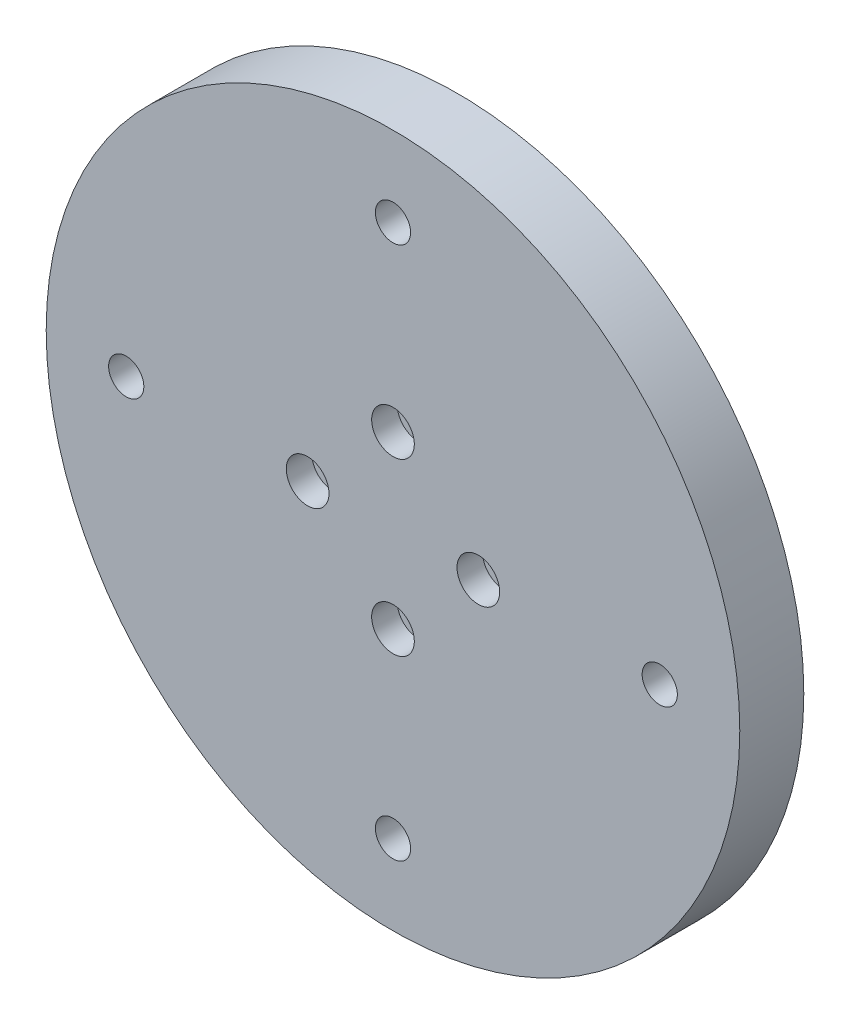
ISO-10303-21;
HEADER;
FILE_DESCRIPTION(('STEP AP214'),'2;1');
FILE_NAME('part.step','',(''),(''),'','','');
FILE_SCHEMA(('AUTOMOTIVE_DESIGN { 1 0 10303 214 1 1 1 1 }'));
ENDSEC;
DATA;
#1=APPLICATION_CONTEXT('core data for automotive mechanical design processes');
#2=APPLICATION_PROTOCOL_DEFINITION('international standard','automotive_design',2000,#1);
#3=PRODUCT_CONTEXT('',#1,'mechanical');
#4=PRODUCT('Part','Part','',(#3));
#5=PRODUCT_RELATED_PRODUCT_CATEGORY('part','',(#4));
#6=PRODUCT_DEFINITION_FORMATION('','',#4);
#7=PRODUCT_DEFINITION_CONTEXT('part definition',#1,'design');
#8=PRODUCT_DEFINITION('design','',#6,#7);
#9=PRODUCT_DEFINITION_SHAPE('','',#8);
#10=(LENGTH_UNIT() NAMED_UNIT(*) SI_UNIT(.MILLI.,.METRE.));
#11=(NAMED_UNIT(*) PLANE_ANGLE_UNIT() SI_UNIT($,.RADIAN.));
#12=(NAMED_UNIT(*) SI_UNIT($,.STERADIAN.) SOLID_ANGLE_UNIT());
#13=UNCERTAINTY_MEASURE_WITH_UNIT(LENGTH_MEASURE(1.E-05),#10,'distance_accuracy_value','');
#14=(GEOMETRIC_REPRESENTATION_CONTEXT(3) GLOBAL_UNCERTAINTY_ASSIGNED_CONTEXT((#13)) GLOBAL_UNIT_ASSIGNED_CONTEXT((#10,
#11,#12)) REPRESENTATION_CONTEXT('',''));
#15=CARTESIAN_POINT('',(0.,0.,0.));
#16=DIRECTION('',(0.,0.,1.));
#17=DIRECTION('',(1.,0.,0.));
#18=AXIS2_PLACEMENT_3D('',#15,#16,#17);
#19=CARTESIAN_POINT('',(0.,8.,0.));
#20=DIRECTION('',(0.,0.,1.));
#21=DIRECTION('',(1.,0.,0.));
#22=AXIS2_PLACEMENT_3D('',#19,#20,#21);
#23=CYLINDRICAL_SURFACE('',#22,1.1);
#24=CARTESIAN_POINT('',(0.,8.,0.));
#25=DIRECTION('',(0.,0.,1.));
#26=DIRECTION('',(1.,0.,0.));
#27=AXIS2_PLACEMENT_3D('',#24,#25,#26);
#28=CIRCLE('',#27,1.1);
#29=CARTESIAN_POINT('',(1.1,8.,0.));
#30=VERTEX_POINT('',#29);
#31=EDGE_CURVE('E49',#30,#30,#28,.T.);
#32=ORIENTED_EDGE('',*,*,#31,.F.);
#33=EDGE_LOOP('',(#32));
#34=FACE_BOUND('',#33,.T.);
#35=CARTESIAN_POINT('',(0.,8.,3.6));
#36=DIRECTION('',(0.,0.,1.));
#37=DIRECTION('',(1.,0.,0.));
#38=AXIS2_PLACEMENT_3D('',#35,#36,#37);
#39=CIRCLE('',#38,1.1);
#40=CARTESIAN_POINT('',(1.1,8.,3.6));
#41=VERTEX_POINT('',#40);
#42=EDGE_CURVE('E37',#41,#41,#39,.F.);
#43=ORIENTED_EDGE('',*,*,#42,.F.);
#44=EDGE_LOOP('',(#43));
#45=FACE_BOUND('',#44,.T.);
#46=ADVANCED_FACE('F33',(#34,#45),#23,.F.);
#47=CARTESIAN_POINT('',(0.,-8.,0.));
#48=DIRECTION('',(0.,0.,1.));
#49=DIRECTION('',(1.,0.,0.));
#50=AXIS2_PLACEMENT_3D('',#47,#48,#49);
#51=CYLINDRICAL_SURFACE('',#50,1.1);
#52=CARTESIAN_POINT('',(0.,-8.,0.));
#53=DIRECTION('',(0.,0.,1.));
#54=DIRECTION('',(1.,0.,0.));
#55=AXIS2_PLACEMENT_3D('',#52,#53,#54);
#56=CIRCLE('',#55,1.1);
#57=CARTESIAN_POINT('',(1.1,-8.,0.));
#58=VERTEX_POINT('',#57);
#59=EDGE_CURVE('E66',#58,#58,#56,.T.);
#60=ORIENTED_EDGE('',*,*,#59,.F.);
#61=EDGE_LOOP('',(#60));
#62=FACE_BOUND('',#61,.T.);
#63=CARTESIAN_POINT('',(0.,-8.,3.6));
#64=DIRECTION('',(0.,0.,1.));
#65=DIRECTION('',(1.,0.,0.));
#66=AXIS2_PLACEMENT_3D('',#63,#64,#65);
#67=CIRCLE('',#66,1.1);
#68=CARTESIAN_POINT('',(1.1,-8.,3.6));
#69=VERTEX_POINT('',#68);
#70=EDGE_CURVE('E58',#69,#69,#67,.F.);
#71=ORIENTED_EDGE('',*,*,#70,.F.);
#72=EDGE_LOOP('',(#71));
#73=FACE_BOUND('',#72,.T.);
#74=ADVANCED_FACE('F173',(#62,#73),#51,.F.);
#75=CARTESIAN_POINT('',(-8.,0.,0.));
#76=DIRECTION('',(0.,0.,1.));
#77=DIRECTION('',(1.,0.,0.));
#78=AXIS2_PLACEMENT_3D('',#75,#76,#77);
#79=CYLINDRICAL_SURFACE('',#78,1.1);
#80=CARTESIAN_POINT('',(-8.,0.,0.));
#81=DIRECTION('',(0.,0.,1.));
#82=DIRECTION('',(1.,0.,0.));
#83=AXIS2_PLACEMENT_3D('',#80,#81,#82);
#84=CIRCLE('',#83,1.1);
#85=CARTESIAN_POINT('',(-6.9,0.,0.));
#86=VERTEX_POINT('',#85);
#87=EDGE_CURVE('E70',#86,#86,#84,.T.);
#88=ORIENTED_EDGE('',*,*,#87,.F.);
#89=EDGE_LOOP('',(#88));
#90=FACE_BOUND('',#89,.T.);
#91=CARTESIAN_POINT('',(-8.,0.,3.6));
#92=DIRECTION('',(0.,0.,1.));
#93=DIRECTION('',(1.,0.,0.));
#94=AXIS2_PLACEMENT_3D('',#91,#92,#93);
#95=CIRCLE('',#94,1.1);
#96=CARTESIAN_POINT('',(-6.9,0.,3.6));
#97=VERTEX_POINT('',#96);
#98=EDGE_CURVE('E55',#97,#97,#95,.F.);
#99=ORIENTED_EDGE('',*,*,#98,.F.);
#100=EDGE_LOOP('',(#99));
#101=FACE_BOUND('',#100,.T.);
#102=ADVANCED_FACE('F179',(#90,#101),#79,.F.);
#103=CARTESIAN_POINT('',(8.,0.,0.));
#104=DIRECTION('',(0.,0.,1.));
#105=DIRECTION('',(1.,0.,0.));
#106=AXIS2_PLACEMENT_3D('',#103,#104,#105);
#107=CYLINDRICAL_SURFACE('',#106,1.1);
#108=CARTESIAN_POINT('',(8.,0.,0.));
#109=DIRECTION('',(0.,0.,1.));
#110=DIRECTION('',(1.,0.,0.));
#111=AXIS2_PLACEMENT_3D('',#108,#109,#110);
#112=CIRCLE('',#111,1.1);
#113=CARTESIAN_POINT('',(9.1,0.,0.));
#114=VERTEX_POINT('',#113);
#115=EDGE_CURVE('E46',#114,#114,#112,.T.);
#116=ORIENTED_EDGE('',*,*,#115,.F.);
#117=EDGE_LOOP('',(#116));
#118=FACE_BOUND('',#117,.T.);
#119=CARTESIAN_POINT('',(8.,0.,3.6));
#120=DIRECTION('',(0.,0.,1.));
#121=DIRECTION('',(1.,0.,0.));
#122=AXIS2_PLACEMENT_3D('',#119,#120,#121);
#123=CIRCLE('',#122,1.1);
#124=CARTESIAN_POINT('',(9.1,0.,3.6));
#125=VERTEX_POINT('',#124);
#126=EDGE_CURVE('E52',#125,#125,#123,.F.);
#127=ORIENTED_EDGE('',*,*,#126,.F.);
#128=EDGE_LOOP('',(#127));
#129=FACE_BOUND('',#128,.T.);
#130=ADVANCED_FACE('F287',(#118,#129),#107,.F.);
#131=CARTESIAN_POINT('',(0.,0.,6.));
#132=DIRECTION('',(0.,0.,-1.));
#133=DIRECTION('',(-1.,0.,0.));
#134=AXIS2_PLACEMENT_3D('',#131,#132,#133);
#135=CYLINDRICAL_SURFACE('',#134,32.5);
#136=CARTESIAN_POINT('',(0.,0.,6.));
#137=DIRECTION('',(0.,0.,1.));
#138=DIRECTION('',(1.,0.,0.));
#139=AXIS2_PLACEMENT_3D('',#136,#137,#138);
#140=CIRCLE('',#139,32.5);
#141=CARTESIAN_POINT('',(32.5,0.,6.));
#142=VERTEX_POINT('',#141);
#143=EDGE_CURVE('E10',#142,#142,#140,.T.);
#144=ORIENTED_EDGE('',*,*,#143,.F.);
#145=EDGE_LOOP('',(#144));
#146=FACE_BOUND('',#145,.T.);
#147=CARTESIAN_POINT('',(0.,0.,0.));
#148=DIRECTION('',(0.,0.,1.));
#149=DIRECTION('',(1.,0.,0.));
#150=AXIS2_PLACEMENT_3D('',#147,#148,#149);
#151=CIRCLE('',#150,32.5);
#152=CARTESIAN_POINT('',(32.5,0.,0.));
#153=VERTEX_POINT('',#152);
#154=EDGE_CURVE('E41',#153,#153,#151,.T.);
#155=ORIENTED_EDGE('',*,*,#154,.T.);
#156=EDGE_LOOP('',(#155));
#157=FACE_BOUND('',#156,.T.);
#158=ADVANCED_FACE('F35',(#146,#157),#135,.T.);
#159=CARTESIAN_POINT('',(0.,0.,6.));
#160=DIRECTION('',(0.,0.,1.));
#161=DIRECTION('',(1.,0.,0.));
#162=AXIS2_PLACEMENT_3D('',#159,#160,#161);
#163=PLANE('',#162);
#164=CARTESIAN_POINT('',(0.,25.,6.));
#165=DIRECTION('',(0.,0.,1.));
#166=DIRECTION('',(1.,0.,0.));
#167=AXIS2_PLACEMENT_3D('',#164,#165,#166);
#168=CIRCLE('',#167,1.65);
#169=CARTESIAN_POINT('',(1.65,25.,6.));
#170=VERTEX_POINT('',#169);
#171=EDGE_CURVE('E120',#170,#170,#168,.T.);
#172=ORIENTED_EDGE('',*,*,#171,.F.);
#173=EDGE_LOOP('',(#172));
#174=FACE_BOUND('',#173,.T.);
#175=CARTESIAN_POINT('',(25.0000000000007,7.07481118762232E-13,6.));
#176=DIRECTION('',(0.,0.,1.));
#177=DIRECTION('',(1.,0.,0.));
#178=AXIS2_PLACEMENT_3D('',#175,#176,#177);
#179=CIRCLE('',#178,1.65000000000055);
#180=CARTESIAN_POINT('',(26.6500000000013,7.07481118762232E-13,6.));
#181=VERTEX_POINT('',#180);
#182=EDGE_CURVE('E114',#181,#181,#179,.T.);
#183=ORIENTED_EDGE('',*,*,#182,.F.);
#184=EDGE_LOOP('',(#183));
#185=FACE_BOUND('',#184,.T.);
#186=CARTESIAN_POINT('',(1.41496223752446E-12,-25.,6.));
#187=DIRECTION('',(0.,0.,1.));
#188=DIRECTION('',(1.,0.,0.));
#189=AXIS2_PLACEMENT_3D('',#186,#187,#188);
#190=CIRCLE('',#189,1.65000000000152);
#191=CARTESIAN_POINT('',(1.65000000000293,-25.,6.));
#192=VERTEX_POINT('',#191);
#193=EDGE_CURVE('E108',#192,#192,#190,.T.);
#194=ORIENTED_EDGE('',*,*,#193,.F.);
#195=EDGE_LOOP('',(#194));
#196=FACE_BOUND('',#195,.T.);
#197=CARTESIAN_POINT('',(-24.9999999999993,-7.105427357601E-13,6.));
#198=DIRECTION('',(0.,0.,1.));
#199=DIRECTION('',(1.,0.,0.));
#200=AXIS2_PLACEMENT_3D('',#197,#198,#199);
#201=CIRCLE('',#200,1.65000000000113);
#202=CARTESIAN_POINT('',(-23.3499999999982,-7.105427357601E-13,6.));
#203=VERTEX_POINT('',#202);
#204=EDGE_CURVE('E102',#203,#203,#201,.T.);
#205=ORIENTED_EDGE('',*,*,#204,.F.);
#206=EDGE_LOOP('',(#205));
#207=FACE_BOUND('',#206,.T.);
#208=CARTESIAN_POINT('',(8.,0.,6.));
#209=DIRECTION('',(0.,0.,1.));
#210=DIRECTION('',(1.,0.,0.));
#211=AXIS2_PLACEMENT_3D('',#208,#209,#210);
#212=CIRCLE('',#211,2.);
#213=CARTESIAN_POINT('',(10.,0.,6.));
#214=VERTEX_POINT('',#213);
#215=EDGE_CURVE('E97',#214,#214,#212,.T.);
#216=ORIENTED_EDGE('',*,*,#215,.F.);
#217=EDGE_LOOP('',(#216));
#218=FACE_BOUND('',#217,.T.);
#219=CARTESIAN_POINT('',(-8.,0.,6.));
#220=DIRECTION('',(0.,0.,1.));
#221=DIRECTION('',(1.,0.,0.));
#222=AXIS2_PLACEMENT_3D('',#219,#220,#221);
#223=CIRCLE('',#222,2.);
#224=CARTESIAN_POINT('',(-6.,0.,6.));
#225=VERTEX_POINT('',#224);
#226=EDGE_CURVE('E91',#225,#225,#223,.T.);
#227=ORIENTED_EDGE('',*,*,#226,.F.);
#228=EDGE_LOOP('',(#227));
#229=FACE_BOUND('',#228,.T.);
#230=CARTESIAN_POINT('',(0.,-8.,6.));
#231=DIRECTION('',(0.,0.,1.));
#232=DIRECTION('',(1.,0.,0.));
#233=AXIS2_PLACEMENT_3D('',#230,#231,#232);
#234=CIRCLE('',#233,2.);
#235=CARTESIAN_POINT('',(2.,-8.,6.));
#236=VERTEX_POINT('',#235);
#237=EDGE_CURVE('E85',#236,#236,#234,.T.);
#238=ORIENTED_EDGE('',*,*,#237,.F.);
#239=EDGE_LOOP('',(#238));
#240=FACE_BOUND('',#239,.T.);
#241=CARTESIAN_POINT('',(0.,8.,6.));
#242=DIRECTION('',(0.,0.,1.));
#243=DIRECTION('',(1.,0.,0.));
#244=AXIS2_PLACEMENT_3D('',#241,#242,#243);
#245=CIRCLE('',#244,2.);
#246=CARTESIAN_POINT('',(2.,8.,6.));
#247=VERTEX_POINT('',#246);
#248=EDGE_CURVE('E78',#247,#247,#245,.T.);
#249=ORIENTED_EDGE('',*,*,#248,.F.);
#250=EDGE_LOOP('',(#249));
#251=FACE_BOUND('',#250,.T.);
#252=ORIENTED_EDGE('',*,*,#143,.T.);
#253=EDGE_LOOP('',(#252));
#254=FACE_BOUND('',#253,.T.);
#255=ADVANCED_FACE('F136',(#174,#185,#196,#207,#218,#229,#240,#251,#254),#163,.T.);
#256=CARTESIAN_POINT('',(0.,0.,0.));
#257=DIRECTION('',(0.,0.,1.));
#258=DIRECTION('',(1.,0.,0.));
#259=AXIS2_PLACEMENT_3D('',#256,#257,#258);
#260=PLANE('',#259);
#261=CARTESIAN_POINT('',(0.,25.,0.));
#262=DIRECTION('',(0.,0.,1.));
#263=DIRECTION('',(1.,0.,0.));
#264=AXIS2_PLACEMENT_3D('',#261,#262,#263);
#265=CIRCLE('',#264,1.65);
#266=CARTESIAN_POINT('',(1.65,25.,0.));
#267=VERTEX_POINT('',#266);
#268=EDGE_CURVE('E82',#267,#267,#265,.T.);
#269=ORIENTED_EDGE('',*,*,#268,.T.);
#270=EDGE_LOOP('',(#269));
#271=FACE_BOUND('',#270,.T.);
#272=CARTESIAN_POINT('',(25.0000000000007,7.07481118762232E-13,0.));
#273=DIRECTION('',(0.,0.,1.));
#274=DIRECTION('',(1.,0.,0.));
#275=AXIS2_PLACEMENT_3D('',#272,#273,#274);
#276=CIRCLE('',#275,1.65000000000055);
#277=CARTESIAN_POINT('',(26.6500000000013,7.07481118762232E-13,0.));
#278=VERTEX_POINT('',#277);
#279=EDGE_CURVE('E117',#278,#278,#276,.T.);
#280=ORIENTED_EDGE('',*,*,#279,.T.);
#281=EDGE_LOOP('',(#280));
#282=FACE_BOUND('',#281,.T.);
#283=CARTESIAN_POINT('',(1.41496223752446E-12,-25.,0.));
#284=DIRECTION('',(0.,0.,1.));
#285=DIRECTION('',(1.,0.,0.));
#286=AXIS2_PLACEMENT_3D('',#283,#284,#285);
#287=CIRCLE('',#286,1.65000000000152);
#288=CARTESIAN_POINT('',(1.65000000000293,-25.,0.));
#289=VERTEX_POINT('',#288);
#290=EDGE_CURVE('E111',#289,#289,#287,.T.);
#291=ORIENTED_EDGE('',*,*,#290,.T.);
#292=EDGE_LOOP('',(#291));
#293=FACE_BOUND('',#292,.T.);
#294=CARTESIAN_POINT('',(-24.9999999999993,-7.105427357601E-13,0.));
#295=DIRECTION('',(0.,0.,1.));
#296=DIRECTION('',(1.,0.,0.));
#297=AXIS2_PLACEMENT_3D('',#294,#295,#296);
#298=CIRCLE('',#297,1.65000000000113);
#299=CARTESIAN_POINT('',(-23.3499999999982,-7.105427357601E-13,0.));
#300=VERTEX_POINT('',#299);
#301=EDGE_CURVE('E105',#300,#300,#298,.T.);
#302=ORIENTED_EDGE('',*,*,#301,.T.);
#303=EDGE_LOOP('',(#302));
#304=FACE_BOUND('',#303,.T.);
#305=ORIENTED_EDGE('',*,*,#115,.T.);
#306=EDGE_LOOP('',(#305));
#307=FACE_BOUND('',#306,.T.);
#308=ORIENTED_EDGE('',*,*,#87,.T.);
#309=EDGE_LOOP('',(#308));
#310=FACE_BOUND('',#309,.T.);
#311=ORIENTED_EDGE('',*,*,#59,.T.);
#312=EDGE_LOOP('',(#311));
#313=FACE_BOUND('',#312,.T.);
#314=ORIENTED_EDGE('',*,*,#31,.T.);
#315=EDGE_LOOP('',(#314));
#316=FACE_BOUND('',#315,.T.);
#317=ORIENTED_EDGE('',*,*,#154,.F.);
#318=EDGE_LOOP('',(#317));
#319=FACE_BOUND('',#318,.T.);
#320=ADVANCED_FACE('F126',(#271,#282,#293,#304,#307,#310,#313,#316,#319),#260,.F.);
#321=CARTESIAN_POINT('',(8.,0.,3.6));
#322=DIRECTION('',(0.,0.,1.));
#323=DIRECTION('',(1.,0.,0.));
#324=AXIS2_PLACEMENT_3D('',#321,#322,#323);
#325=PLANE('',#324);
#326=CARTESIAN_POINT('',(8.,0.,3.6));
#327=DIRECTION('',(0.,0.,1.));
#328=DIRECTION('',(1.,0.,0.));
#329=AXIS2_PLACEMENT_3D('',#326,#327,#328);
#330=CIRCLE('',#329,2.);
#331=CARTESIAN_POINT('',(10.,0.,3.6));
#332=VERTEX_POINT('',#331);
#333=EDGE_CURVE('E56',#332,#332,#330,.T.);
#334=ORIENTED_EDGE('',*,*,#333,.T.);
#335=EDGE_LOOP('',(#334));
#336=FACE_BOUND('',#335,.T.);
#337=ORIENTED_EDGE('',*,*,#126,.T.);
#338=EDGE_LOOP('',(#337));
#339=FACE_BOUND('',#338,.T.);
#340=ADVANCED_FACE('F185',(#336,#339),#325,.T.);
#341=CARTESIAN_POINT('',(8.,0.,3.6));
#342=DIRECTION('',(0.,0.,1.));
#343=DIRECTION('',(1.,0.,0.));
#344=AXIS2_PLACEMENT_3D('',#341,#342,#343);
#345=CYLINDRICAL_SURFACE('',#344,2.);
#346=ORIENTED_EDGE('',*,*,#333,.F.);
#347=EDGE_LOOP('',(#346));
#348=FACE_BOUND('',#347,.T.);
#349=ORIENTED_EDGE('',*,*,#215,.T.);
#350=EDGE_LOOP('',(#349));
#351=FACE_BOUND('',#350,.T.);
#352=ADVANCED_FACE('F189',(#348,#351),#345,.F.);
#353=CARTESIAN_POINT('',(-8.,0.,3.6));
#354=DIRECTION('',(0.,0.,1.));
#355=DIRECTION('',(1.,0.,0.));
#356=AXIS2_PLACEMENT_3D('',#353,#354,#355);
#357=PLANE('',#356);
#358=CARTESIAN_POINT('',(-8.,0.,3.6));
#359=DIRECTION('',(0.,0.,1.));
#360=DIRECTION('',(1.,0.,0.));
#361=AXIS2_PLACEMENT_3D('',#358,#359,#360);
#362=CIRCLE('',#361,2.);
#363=CARTESIAN_POINT('',(-6.,0.,3.6));
#364=VERTEX_POINT('',#363);
#365=EDGE_CURVE('E94',#364,#364,#362,.T.);
#366=ORIENTED_EDGE('',*,*,#365,.T.);
#367=EDGE_LOOP('',(#366));
#368=FACE_BOUND('',#367,.T.);
#369=ORIENTED_EDGE('',*,*,#98,.T.);
#370=EDGE_LOOP('',(#369));
#371=FACE_BOUND('',#370,.T.);
#372=ADVANCED_FACE('F195',(#368,#371),#357,.T.);
#373=CARTESIAN_POINT('',(-8.,0.,3.6));
#374=DIRECTION('',(0.,0.,1.));
#375=DIRECTION('',(1.,0.,0.));
#376=AXIS2_PLACEMENT_3D('',#373,#374,#375);
#377=CYLINDRICAL_SURFACE('',#376,2.);
#378=ORIENTED_EDGE('',*,*,#365,.F.);
#379=EDGE_LOOP('',(#378));
#380=FACE_BOUND('',#379,.T.);
#381=ORIENTED_EDGE('',*,*,#226,.T.);
#382=EDGE_LOOP('',(#381));
#383=FACE_BOUND('',#382,.T.);
#384=ADVANCED_FACE('F203',(#380,#383),#377,.F.);
#385=CARTESIAN_POINT('',(0.,-8.,3.6));
#386=DIRECTION('',(0.,0.,1.));
#387=DIRECTION('',(1.,0.,0.));
#388=AXIS2_PLACEMENT_3D('',#385,#386,#387);
#389=PLANE('',#388);
#390=CARTESIAN_POINT('',(0.,-8.,3.6));
#391=DIRECTION('',(0.,0.,1.));
#392=DIRECTION('',(1.,0.,0.));
#393=AXIS2_PLACEMENT_3D('',#390,#391,#392);
#394=CIRCLE('',#393,2.);
#395=CARTESIAN_POINT('',(2.,-8.,3.6));
#396=VERTEX_POINT('',#395);
#397=EDGE_CURVE('E88',#396,#396,#394,.T.);
#398=ORIENTED_EDGE('',*,*,#397,.T.);
#399=EDGE_LOOP('',(#398));
#400=FACE_BOUND('',#399,.T.);
#401=ORIENTED_EDGE('',*,*,#70,.T.);
#402=EDGE_LOOP('',(#401));
#403=FACE_BOUND('',#402,.T.);
#404=ADVANCED_FACE('F207',(#400,#403),#389,.T.);
#405=CARTESIAN_POINT('',(0.,-8.,3.6));
#406=DIRECTION('',(0.,0.,1.));
#407=DIRECTION('',(1.,0.,0.));
#408=AXIS2_PLACEMENT_3D('',#405,#406,#407);
#409=CYLINDRICAL_SURFACE('',#408,2.);
#410=ORIENTED_EDGE('',*,*,#397,.F.);
#411=EDGE_LOOP('',(#410));
#412=FACE_BOUND('',#411,.T.);
#413=ORIENTED_EDGE('',*,*,#237,.T.);
#414=EDGE_LOOP('',(#413));
#415=FACE_BOUND('',#414,.T.);
#416=ADVANCED_FACE('F167',(#412,#415),#409,.F.);
#417=CARTESIAN_POINT('',(0.,8.,3.6));
#418=DIRECTION('',(0.,0.,1.));
#419=DIRECTION('',(1.,0.,0.));
#420=AXIS2_PLACEMENT_3D('',#417,#418,#419);
#421=PLANE('',#420);
#422=CARTESIAN_POINT('',(0.,8.,3.6));
#423=DIRECTION('',(0.,0.,1.));
#424=DIRECTION('',(1.,0.,0.));
#425=AXIS2_PLACEMENT_3D('',#422,#423,#424);
#426=CIRCLE('',#425,2.);
#427=CARTESIAN_POINT('',(2.,8.,3.6));
#428=VERTEX_POINT('',#427);
#429=EDGE_CURVE('E81',#428,#428,#426,.T.);
#430=ORIENTED_EDGE('',*,*,#429,.T.);
#431=EDGE_LOOP('',(#430));
#432=FACE_BOUND('',#431,.T.);
#433=ORIENTED_EDGE('',*,*,#42,.T.);
#434=EDGE_LOOP('',(#433));
#435=FACE_BOUND('',#434,.T.);
#436=ADVANCED_FACE('F157',(#432,#435),#421,.T.);
#437=CARTESIAN_POINT('',(0.,8.,3.6));
#438=DIRECTION('',(0.,0.,1.));
#439=DIRECTION('',(1.,0.,0.));
#440=AXIS2_PLACEMENT_3D('',#437,#438,#439);
#441=CYLINDRICAL_SURFACE('',#440,2.);
#442=ORIENTED_EDGE('',*,*,#429,.F.);
#443=EDGE_LOOP('',(#442));
#444=FACE_BOUND('',#443,.T.);
#445=ORIENTED_EDGE('',*,*,#248,.T.);
#446=EDGE_LOOP('',(#445));
#447=FACE_BOUND('',#446,.T.);
#448=ADVANCED_FACE('F154',(#444,#447),#441,.F.);
#449=CARTESIAN_POINT('',(-24.9999999999993,-7.105427357601E-13,0.));
#450=DIRECTION('',(0.,0.,1.));
#451=DIRECTION('',(1.,0.,0.));
#452=AXIS2_PLACEMENT_3D('',#449,#450,#451);
#453=CYLINDRICAL_SURFACE('',#452,1.65000000000113);
#454=ORIENTED_EDGE('',*,*,#301,.F.);
#455=EDGE_LOOP('',(#454));
#456=FACE_BOUND('',#455,.T.);
#457=ORIENTED_EDGE('',*,*,#204,.T.);
#458=EDGE_LOOP('',(#457));
#459=FACE_BOUND('',#458,.T.);
#460=ADVANCED_FACE('F156',(#456,#459),#453,.F.);
#461=CARTESIAN_POINT('',(1.41496223752446E-12,-25.,0.));
#462=DIRECTION('',(0.,0.,1.));
#463=DIRECTION('',(1.,0.,0.));
#464=AXIS2_PLACEMENT_3D('',#461,#462,#463);
#465=CYLINDRICAL_SURFACE('',#464,1.65000000000152);
#466=ORIENTED_EDGE('',*,*,#290,.F.);
#467=EDGE_LOOP('',(#466));
#468=FACE_BOUND('',#467,.T.);
#469=ORIENTED_EDGE('',*,*,#193,.T.);
#470=EDGE_LOOP('',(#469));
#471=FACE_BOUND('',#470,.T.);
#472=ADVANCED_FACE('F164',(#468,#471),#465,.F.);
#473=CARTESIAN_POINT('',(25.0000000000007,7.07481118762232E-13,0.));
#474=DIRECTION('',(0.,0.,1.));
#475=DIRECTION('',(1.,0.,0.));
#476=AXIS2_PLACEMENT_3D('',#473,#474,#475);
#477=CYLINDRICAL_SURFACE('',#476,1.65000000000055);
#478=ORIENTED_EDGE('',*,*,#279,.F.);
#479=EDGE_LOOP('',(#478));
#480=FACE_BOUND('',#479,.T.);
#481=ORIENTED_EDGE('',*,*,#182,.T.);
#482=EDGE_LOOP('',(#481));
#483=FACE_BOUND('',#482,.T.);
#484=ADVANCED_FACE('F132',(#480,#483),#477,.F.);
#485=CARTESIAN_POINT('',(0.,25.,0.));
#486=DIRECTION('',(0.,0.,1.));
#487=DIRECTION('',(1.,0.,0.));
#488=AXIS2_PLACEMENT_3D('',#485,#486,#487);
#489=CYLINDRICAL_SURFACE('',#488,1.65);
#490=ORIENTED_EDGE('',*,*,#268,.F.);
#491=EDGE_LOOP('',(#490));
#492=FACE_BOUND('',#491,.T.);
#493=ORIENTED_EDGE('',*,*,#171,.T.);
#494=EDGE_LOOP('',(#493));
#495=FACE_BOUND('',#494,.T.);
#496=ADVANCED_FACE('F129',(#492,#495),#489,.F.);
#497=CLOSED_SHELL('',(#46,#74,#102,#130,#158,#255,#320,#340,#352,#372,#384,#404,#416,#436,#448,
#460,#472,#484,#496));
#498=MANIFOLD_SOLID_BREP('B2',#497);
#499=ADVANCED_BREP_SHAPE_REPRESENTATION('',(#18,#498),#14);
#500=SHAPE_DEFINITION_REPRESENTATION(#9,#499);
ENDSEC;
END-ISO-10303-21;
